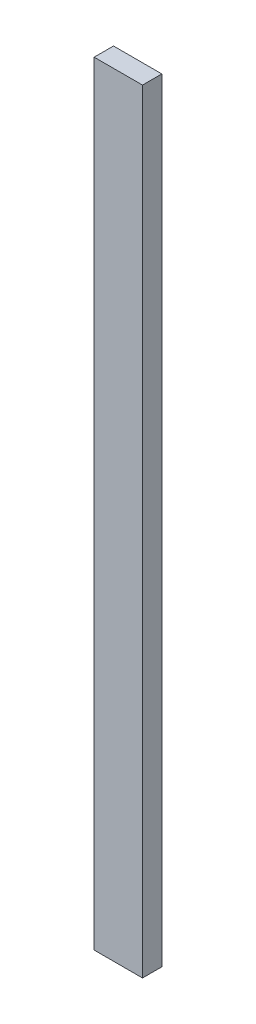
ISO-10303-21;
HEADER;
FILE_DESCRIPTION(('STEP AP214'),'2;1');
FILE_NAME('part.step','',(''),(''),'','','');
FILE_SCHEMA(('AUTOMOTIVE_DESIGN { 1 0 10303 214 1 1 1 1 }'));
ENDSEC;
DATA;
#1=APPLICATION_CONTEXT('core data for automotive mechanical design processes');
#2=APPLICATION_PROTOCOL_DEFINITION('international standard','automotive_design',2000,#1);
#3=PRODUCT_CONTEXT('',#1,'mechanical');
#4=PRODUCT('Part','Part','',(#3));
#5=PRODUCT_RELATED_PRODUCT_CATEGORY('part','',(#4));
#6=PRODUCT_DEFINITION_FORMATION('','',#4);
#7=PRODUCT_DEFINITION_CONTEXT('part definition',#1,'design');
#8=PRODUCT_DEFINITION('design','',#6,#7);
#9=PRODUCT_DEFINITION_SHAPE('','',#8);
#10=(LENGTH_UNIT() NAMED_UNIT(*) SI_UNIT(.MILLI.,.METRE.));
#11=(NAMED_UNIT(*) PLANE_ANGLE_UNIT() SI_UNIT($,.RADIAN.));
#12=(NAMED_UNIT(*) SI_UNIT($,.STERADIAN.) SOLID_ANGLE_UNIT());
#13=UNCERTAINTY_MEASURE_WITH_UNIT(LENGTH_MEASURE(1.E-05),#10,'distance_accuracy_value','');
#14=(GEOMETRIC_REPRESENTATION_CONTEXT(3) GLOBAL_UNCERTAINTY_ASSIGNED_CONTEXT((#13)) GLOBAL_UNIT_ASSIGNED_CONTEXT((#10,
#11,#12)) REPRESENTATION_CONTEXT('',''));
#15=CARTESIAN_POINT('',(0.,0.,0.));
#16=DIRECTION('',(0.,0.,1.));
#17=DIRECTION('',(1.,0.,0.));
#18=AXIS2_PLACEMENT_3D('',#15,#16,#17);
#19=CARTESIAN_POINT('',(125.,2000.,100.));
#20=DIRECTION('',(-1.,0.,0.));
#21=DIRECTION('',(0.,0.,1.));
#22=AXIS2_PLACEMENT_3D('',#19,#20,#21);
#23=PLANE('',#22);
#24=DIRECTION('',(0.,1.,0.));
#25=VECTOR('',#24,1.);
#26=CARTESIAN_POINT('',(125.,2000.,0.));
#27=LINE('',#26,#25);
#28=CARTESIAN_POINT('',(125.,-2000.,0.));
#29=VERTEX_POINT('',#28);
#30=CARTESIAN_POINT('',(125.,2000.,0.));
#31=VERTEX_POINT('',#30);
#32=EDGE_CURVE('E111',#29,#31,#27,.T.);
#33=ORIENTED_EDGE('',*,*,#32,.T.);
#34=DIRECTION('',(0.,0.,-1.));
#35=VECTOR('',#34,1.);
#36=CARTESIAN_POINT('',(125.,2000.,100.));
#37=LINE('',#36,#35);
#38=CARTESIAN_POINT('',(125.,2000.,100.));
#39=VERTEX_POINT('',#38);
#40=EDGE_CURVE('E11',#39,#31,#37,.T.);
#41=ORIENTED_EDGE('',*,*,#40,.F.);
#42=DIRECTION('',(0.,1.,0.));
#43=VECTOR('',#42,1.);
#44=CARTESIAN_POINT('',(125.,2000.,100.));
#45=LINE('',#44,#43);
#46=CARTESIAN_POINT('',(125.,-2000.,100.));
#47=VERTEX_POINT('',#46);
#48=EDGE_CURVE('E95',#47,#39,#45,.T.);
#49=ORIENTED_EDGE('',*,*,#48,.F.);
#50=DIRECTION('',(0.,0.,-1.));
#51=VECTOR('',#50,1.);
#52=CARTESIAN_POINT('',(125.,-2000.,100.));
#53=LINE('',#52,#51);
#54=EDGE_CURVE('E107',#47,#29,#53,.T.);
#55=ORIENTED_EDGE('',*,*,#54,.T.);
#56=EDGE_LOOP('',(#33,#41,#49,#55));
#57=FACE_BOUND('',#56,.T.);
#58=ADVANCED_FACE('F43',(#57),#23,.F.);
#59=CARTESIAN_POINT('',(-125.,2000.,100.));
#60=DIRECTION('',(0.,-1.,0.));
#61=DIRECTION('',(0.,0.,-1.));
#62=AXIS2_PLACEMENT_3D('',#59,#60,#61);
#63=PLANE('',#62);
#64=DIRECTION('',(-1.,0.,0.));
#65=VECTOR('',#64,1.);
#66=CARTESIAN_POINT('',(-125.,2000.,0.));
#67=LINE('',#66,#65);
#68=CARTESIAN_POINT('',(-125.,2000.,0.));
#69=VERTEX_POINT('',#68);
#70=EDGE_CURVE('E100',#31,#69,#67,.T.);
#71=ORIENTED_EDGE('',*,*,#70,.T.);
#72=DIRECTION('',(0.,0.,-1.));
#73=VECTOR('',#72,1.);
#74=CARTESIAN_POINT('',(-125.,2000.,100.));
#75=LINE('',#74,#73);
#76=CARTESIAN_POINT('',(-125.,2000.,100.));
#77=VERTEX_POINT('',#76);
#78=EDGE_CURVE('E52',#77,#69,#75,.T.);
#79=ORIENTED_EDGE('',*,*,#78,.F.);
#80=DIRECTION('',(-1.,0.,0.));
#81=VECTOR('',#80,1.);
#82=CARTESIAN_POINT('',(-125.,2000.,100.));
#83=LINE('',#82,#81);
#84=EDGE_CURVE('E90',#39,#77,#83,.T.);
#85=ORIENTED_EDGE('',*,*,#84,.F.);
#86=ORIENTED_EDGE('',*,*,#40,.T.);
#87=EDGE_LOOP('',(#71,#79,#85,#86));
#88=FACE_BOUND('',#87,.T.);
#89=ADVANCED_FACE('F99',(#88),#63,.F.);
#90=CARTESIAN_POINT('',(-125.,2000.,100.));
#91=DIRECTION('',(1.,0.,0.));
#92=DIRECTION('',(0.,0.,-1.));
#93=AXIS2_PLACEMENT_3D('',#90,#91,#92);
#94=PLANE('',#93);
#95=DIRECTION('',(0.,-1.,0.));
#96=VECTOR('',#95,1.);
#97=CARTESIAN_POINT('',(-125.,2000.,0.));
#98=LINE('',#97,#96);
#99=CARTESIAN_POINT('',(-125.,-2000.,0.));
#100=VERTEX_POINT('',#99);
#101=EDGE_CURVE('E77',#69,#100,#98,.T.);
#102=ORIENTED_EDGE('',*,*,#101,.T.);
#103=DIRECTION('',(0.,0.,-1.));
#104=VECTOR('',#103,1.);
#105=CARTESIAN_POINT('',(-125.,-2000.,100.));
#106=LINE('',#105,#104);
#107=CARTESIAN_POINT('',(-125.,-2000.,100.));
#108=VERTEX_POINT('',#107);
#109=EDGE_CURVE('E102',#108,#100,#106,.T.);
#110=ORIENTED_EDGE('',*,*,#109,.F.);
#111=DIRECTION('',(0.,-1.,0.));
#112=VECTOR('',#111,1.);
#113=CARTESIAN_POINT('',(-125.,2000.,100.));
#114=LINE('',#113,#112);
#115=EDGE_CURVE('E93',#77,#108,#114,.T.);
#116=ORIENTED_EDGE('',*,*,#115,.F.);
#117=ORIENTED_EDGE('',*,*,#78,.T.);
#118=EDGE_LOOP('',(#102,#110,#116,#117));
#119=FACE_BOUND('',#118,.T.);
#120=ADVANCED_FACE('F103',(#119),#94,.F.);
#121=CARTESIAN_POINT('',(-125.,-2000.,100.));
#122=DIRECTION('',(0.,1.,0.));
#123=DIRECTION('',(0.,0.,1.));
#124=AXIS2_PLACEMENT_3D('',#121,#122,#123);
#125=PLANE('',#124);
#126=DIRECTION('',(1.,0.,0.));
#127=VECTOR('',#126,1.);
#128=CARTESIAN_POINT('',(-125.,-2000.,0.));
#129=LINE('',#128,#127);
#130=EDGE_CURVE('E83',#100,#29,#129,.T.);
#131=ORIENTED_EDGE('',*,*,#130,.T.);
#132=ORIENTED_EDGE('',*,*,#54,.F.);
#133=DIRECTION('',(1.,0.,0.));
#134=VECTOR('',#133,1.);
#135=CARTESIAN_POINT('',(-125.,-2000.,100.));
#136=LINE('',#135,#134);
#137=EDGE_CURVE('E60',#108,#47,#136,.T.);
#138=ORIENTED_EDGE('',*,*,#137,.F.);
#139=ORIENTED_EDGE('',*,*,#109,.T.);
#140=EDGE_LOOP('',(#131,#132,#138,#139));
#141=FACE_BOUND('',#140,.T.);
#142=ADVANCED_FACE('F124',(#141),#125,.F.);
#143=CARTESIAN_POINT('',(0.,0.,100.));
#144=DIRECTION('',(0.,0.,1.));
#145=DIRECTION('',(1.,0.,0.));
#146=AXIS2_PLACEMENT_3D('',#143,#144,#145);
#147=PLANE('',#146);
#148=ORIENTED_EDGE('',*,*,#48,.T.);
#149=ORIENTED_EDGE('',*,*,#84,.T.);
#150=ORIENTED_EDGE('',*,*,#115,.T.);
#151=ORIENTED_EDGE('',*,*,#137,.T.);
#152=EDGE_LOOP('',(#148,#149,#150,#151));
#153=FACE_BOUND('',#152,.T.);
#154=ADVANCED_FACE('F91',(#153),#147,.T.);
#155=CARTESIAN_POINT('',(0.,0.,0.));
#156=DIRECTION('',(0.,0.,1.));
#157=DIRECTION('',(1.,0.,0.));
#158=AXIS2_PLACEMENT_3D('',#155,#156,#157);
#159=PLANE('',#158);
#160=ORIENTED_EDGE('',*,*,#32,.F.);
#161=ORIENTED_EDGE('',*,*,#130,.F.);
#162=ORIENTED_EDGE('',*,*,#101,.F.);
#163=ORIENTED_EDGE('',*,*,#70,.F.);
#164=EDGE_LOOP('',(#160,#161,#162,#163));
#165=FACE_BOUND('',#164,.T.);
#166=ADVANCED_FACE('F127',(#165),#159,.F.);
#167=CLOSED_SHELL('',(#58,#89,#120,#142,#154,#166));
#168=MANIFOLD_SOLID_BREP('B2',#167);
#169=ADVANCED_BREP_SHAPE_REPRESENTATION('',(#18,#168),#14);
#170=SHAPE_DEFINITION_REPRESENTATION(#9,#169);
ENDSEC;
END-ISO-10303-21;
